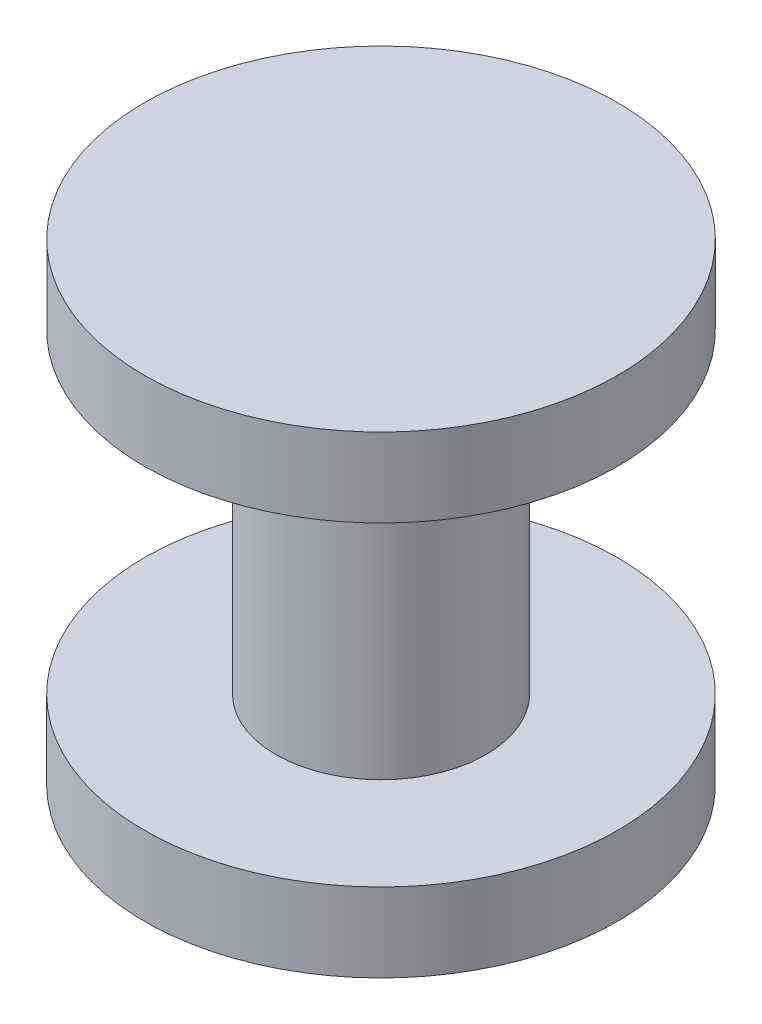
ISO-10303-21;
HEADER;
FILE_DESCRIPTION(('STEP AP214'),'2;1');
FILE_NAME('part.step','',(''),(''),'','','');
FILE_SCHEMA(('AUTOMOTIVE_DESIGN { 1 0 10303 214 1 1 1 1 }'));
ENDSEC;
DATA;
#1=APPLICATION_CONTEXT('core data for automotive mechanical design processes');
#2=APPLICATION_PROTOCOL_DEFINITION('international standard','automotive_design',2000,#1);
#3=PRODUCT_CONTEXT('',#1,'mechanical');
#4=PRODUCT('Part','Part','',(#3));
#5=PRODUCT_RELATED_PRODUCT_CATEGORY('part','',(#4));
#6=PRODUCT_DEFINITION_FORMATION('','',#4);
#7=PRODUCT_DEFINITION_CONTEXT('part definition',#1,'design');
#8=PRODUCT_DEFINITION('design','',#6,#7);
#9=PRODUCT_DEFINITION_SHAPE('','',#8);
#10=(LENGTH_UNIT() NAMED_UNIT(*) SI_UNIT(.MILLI.,.METRE.));
#11=(NAMED_UNIT(*) PLANE_ANGLE_UNIT() SI_UNIT($,.RADIAN.));
#12=(NAMED_UNIT(*) SI_UNIT($,.STERADIAN.) SOLID_ANGLE_UNIT());
#13=UNCERTAINTY_MEASURE_WITH_UNIT(LENGTH_MEASURE(1.E-05),#10,'distance_accuracy_value','');
#14=(GEOMETRIC_REPRESENTATION_CONTEXT(3) GLOBAL_UNCERTAINTY_ASSIGNED_CONTEXT((#13)) GLOBAL_UNIT_ASSIGNED_CONTEXT((#10,
#11,#12)) REPRESENTATION_CONTEXT('',''));
#15=CARTESIAN_POINT('',(0.,0.,0.));
#16=DIRECTION('',(0.,0.,1.));
#17=DIRECTION('',(1.,0.,0.));
#18=AXIS2_PLACEMENT_3D('',#15,#16,#17);
#19=CARTESIAN_POINT('',(0.,6.,0.));
#20=DIRECTION('',(0.,-1.,0.));
#21=DIRECTION('',(0.,0.,-1.));
#22=AXIS2_PLACEMENT_3D('',#19,#20,#21);
#23=CYLINDRICAL_SURFACE('',#22,2.);
#24=CARTESIAN_POINT('',(0.,6.,0.));
#25=DIRECTION('',(0.,1.,0.));
#26=DIRECTION('',(0.,0.,1.));
#27=AXIS2_PLACEMENT_3D('',#24,#25,#26);
#28=CIRCLE('',#27,2.);
#29=CARTESIAN_POINT('',(0.,6.,2.));
#30=VERTEX_POINT('',#29);
#31=EDGE_CURVE('E10',#30,#30,#28,.T.);
#32=ORIENTED_EDGE('',*,*,#31,.F.);
#33=EDGE_LOOP('',(#32));
#34=FACE_BOUND('',#33,.T.);
#35=CARTESIAN_POINT('',(0.,0.,0.));
#36=DIRECTION('',(0.,1.,0.));
#37=DIRECTION('',(0.,0.,1.));
#38=AXIS2_PLACEMENT_3D('',#35,#36,#37);
#39=CIRCLE('',#38,2.);
#40=CARTESIAN_POINT('',(0.,0.,2.));
#41=VERTEX_POINT('',#40);
#42=EDGE_CURVE('E34',#41,#41,#39,.T.);
#43=ORIENTED_EDGE('',*,*,#42,.T.);
#44=EDGE_LOOP('',(#43));
#45=FACE_BOUND('',#44,.T.);
#46=ADVANCED_FACE('F31',(#34,#45),#23,.T.);
#47=CARTESIAN_POINT('',(0.,7.5,0.));
#48=DIRECTION('',(0.,-1.,0.));
#49=DIRECTION('',(0.,0.,-1.));
#50=AXIS2_PLACEMENT_3D('',#47,#48,#49);
#51=CYLINDRICAL_SURFACE('',#50,4.5);
#52=CARTESIAN_POINT('',(0.,7.5,0.));
#53=DIRECTION('',(0.,1.,0.));
#54=DIRECTION('',(0.,0.,1.));
#55=AXIS2_PLACEMENT_3D('',#52,#53,#54);
#56=CIRCLE('',#55,4.5);
#57=CARTESIAN_POINT('',(0.,7.5,4.5));
#58=VERTEX_POINT('',#57);
#59=EDGE_CURVE('E38',#58,#58,#56,.T.);
#60=ORIENTED_EDGE('',*,*,#59,.F.);
#61=EDGE_LOOP('',(#60));
#62=FACE_BOUND('',#61,.T.);
#63=CARTESIAN_POINT('',(0.,6.,0.));
#64=DIRECTION('',(0.,1.,0.));
#65=DIRECTION('',(0.,0.,1.));
#66=AXIS2_PLACEMENT_3D('',#63,#64,#65);
#67=CIRCLE('',#66,4.5);
#68=CARTESIAN_POINT('',(0.,6.,4.5));
#69=VERTEX_POINT('',#68);
#70=EDGE_CURVE('E42',#69,#69,#67,.T.);
#71=ORIENTED_EDGE('',*,*,#70,.T.);
#72=EDGE_LOOP('',(#71));
#73=FACE_BOUND('',#72,.T.);
#74=ADVANCED_FACE('F79',(#62,#73),#51,.T.);
#75=CARTESIAN_POINT('',(0.,7.5,0.));
#76=DIRECTION('',(0.,1.,0.));
#77=DIRECTION('',(0.,0.,1.));
#78=AXIS2_PLACEMENT_3D('',#75,#76,#77);
#79=PLANE('',#78);
#80=ORIENTED_EDGE('',*,*,#59,.T.);
#81=EDGE_LOOP('',(#80));
#82=FACE_BOUND('',#81,.T.);
#83=ADVANCED_FACE('F75',(#82),#79,.T.);
#84=CARTESIAN_POINT('',(0.,6.,0.));
#85=DIRECTION('',(0.,1.,0.));
#86=DIRECTION('',(0.,0.,1.));
#87=AXIS2_PLACEMENT_3D('',#84,#85,#86);
#88=PLANE('',#87);
#89=ORIENTED_EDGE('',*,*,#31,.T.);
#90=EDGE_LOOP('',(#89));
#91=FACE_BOUND('',#90,.T.);
#92=ORIENTED_EDGE('',*,*,#70,.F.);
#93=EDGE_LOOP('',(#92));
#94=FACE_BOUND('',#93,.T.);
#95=ADVANCED_FACE('F67',(#91,#94),#88,.F.);
#96=CARTESIAN_POINT('',(0.,-1.5,0.));
#97=DIRECTION('',(0.,1.,0.));
#98=DIRECTION('',(0.,0.,1.));
#99=AXIS2_PLACEMENT_3D('',#96,#97,#98);
#100=CYLINDRICAL_SURFACE('',#99,4.5);
#101=CARTESIAN_POINT('',(0.,-1.5,0.));
#102=DIRECTION('',(0.,-1.,0.));
#103=DIRECTION('',(0.,0.,-1.));
#104=AXIS2_PLACEMENT_3D('',#101,#102,#103);
#105=CIRCLE('',#104,4.5);
#106=CARTESIAN_POINT('',(0.,-1.5,-4.5));
#107=VERTEX_POINT('',#106);
#108=EDGE_CURVE('E50',#107,#107,#105,.T.);
#109=ORIENTED_EDGE('',*,*,#108,.F.);
#110=EDGE_LOOP('',(#109));
#111=FACE_BOUND('',#110,.T.);
#112=CARTESIAN_POINT('',(0.,0.,0.));
#113=DIRECTION('',(0.,-1.,0.));
#114=DIRECTION('',(0.,0.,-1.));
#115=AXIS2_PLACEMENT_3D('',#112,#113,#114);
#116=CIRCLE('',#115,4.5);
#117=CARTESIAN_POINT('',(0.,0.,-4.5));
#118=VERTEX_POINT('',#117);
#119=EDGE_CURVE('E47',#118,#118,#116,.T.);
#120=ORIENTED_EDGE('',*,*,#119,.T.);
#121=EDGE_LOOP('',(#120));
#122=FACE_BOUND('',#121,.T.);
#123=ADVANCED_FACE('F65',(#111,#122),#100,.T.);
#124=CARTESIAN_POINT('',(0.,-1.5,0.));
#125=DIRECTION('',(0.,-1.,0.));
#126=DIRECTION('',(0.,0.,-1.));
#127=AXIS2_PLACEMENT_3D('',#124,#125,#126);
#128=PLANE('',#127);
#129=ORIENTED_EDGE('',*,*,#108,.T.);
#130=EDGE_LOOP('',(#129));
#131=FACE_BOUND('',#130,.T.);
#132=ADVANCED_FACE('F61',(#131),#128,.T.);
#133=CARTESIAN_POINT('',(0.,0.,0.));
#134=DIRECTION('',(0.,-1.,0.));
#135=DIRECTION('',(0.,0.,-1.));
#136=AXIS2_PLACEMENT_3D('',#133,#134,#135);
#137=PLANE('',#136);
#138=ORIENTED_EDGE('',*,*,#42,.F.);
#139=EDGE_LOOP('',(#138));
#140=FACE_BOUND('',#139,.T.);
#141=ORIENTED_EDGE('',*,*,#119,.F.);
#142=EDGE_LOOP('',(#141));
#143=FACE_BOUND('',#142,.T.);
#144=ADVANCED_FACE('F58',(#140,#143),#137,.F.);
#145=CLOSED_SHELL('',(#46,#74,#83,#95,#123,#132,#144));
#146=MANIFOLD_SOLID_BREP('B2',#145);
#147=ADVANCED_BREP_SHAPE_REPRESENTATION('',(#18,#146),#14);
#148=SHAPE_DEFINITION_REPRESENTATION(#9,#147);
ENDSEC;
END-ISO-10303-21;
